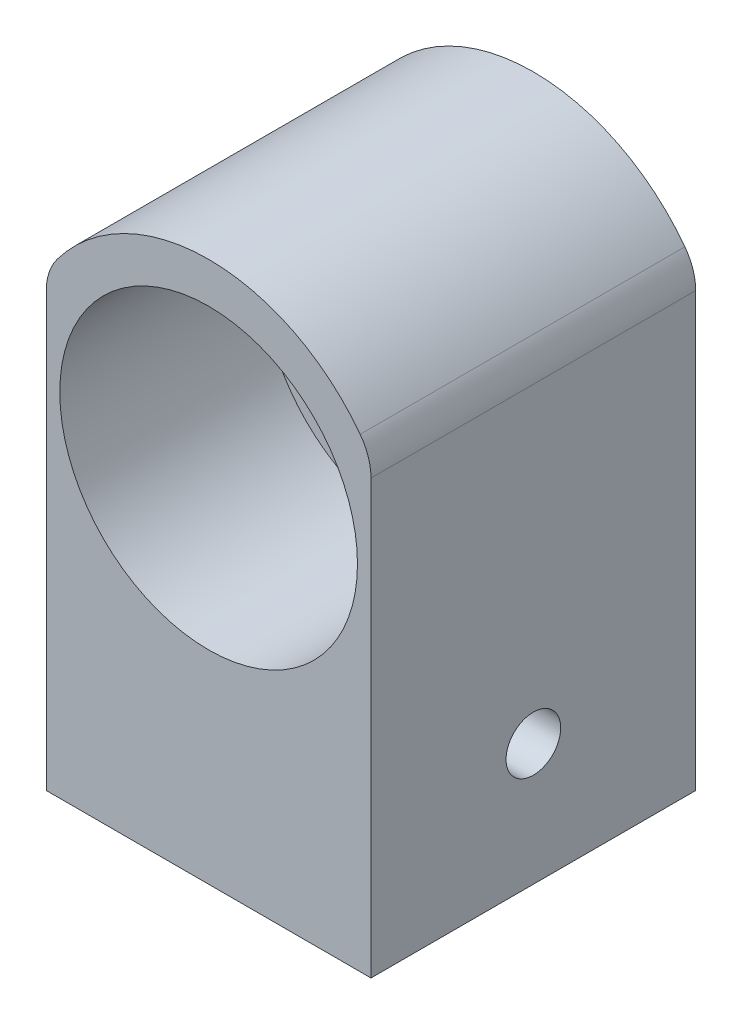
ISO-10303-21;
HEADER;
FILE_DESCRIPTION(('STEP AP214'),'2;1');
FILE_NAME('part.step','',(''),(''),'','','');
FILE_SCHEMA(('AUTOMOTIVE_DESIGN { 1 0 10303 214 1 1 1 1 }'));
ENDSEC;
DATA;
#1=APPLICATION_CONTEXT('core data for automotive mechanical design processes');
#2=APPLICATION_PROTOCOL_DEFINITION('international standard','automotive_design',2000,#1);
#3=PRODUCT_CONTEXT('',#1,'mechanical');
#4=PRODUCT('Part','Part','',(#3));
#5=PRODUCT_RELATED_PRODUCT_CATEGORY('part','',(#4));
#6=PRODUCT_DEFINITION_FORMATION('','',#4);
#7=PRODUCT_DEFINITION_CONTEXT('part definition',#1,'design');
#8=PRODUCT_DEFINITION('design','',#6,#7);
#9=PRODUCT_DEFINITION_SHAPE('','',#8);
#10=(LENGTH_UNIT() NAMED_UNIT(*) SI_UNIT(.MILLI.,.METRE.));
#11=(NAMED_UNIT(*) PLANE_ANGLE_UNIT() SI_UNIT($,.RADIAN.));
#12=(NAMED_UNIT(*) SI_UNIT($,.STERADIAN.) SOLID_ANGLE_UNIT());
#13=UNCERTAINTY_MEASURE_WITH_UNIT(LENGTH_MEASURE(1.E-05),#10,'distance_accuracy_value','');
#14=(GEOMETRIC_REPRESENTATION_CONTEXT(3) GLOBAL_UNCERTAINTY_ASSIGNED_CONTEXT((#13)) GLOBAL_UNIT_ASSIGNED_CONTEXT((#10,
#11,#12)) REPRESENTATION_CONTEXT('',''));
#15=CARTESIAN_POINT('',(0.,0.,0.));
#16=DIRECTION('',(0.,0.,1.));
#17=DIRECTION('',(1.,0.,0.));
#18=AXIS2_PLACEMENT_3D('',#15,#16,#17);
#19=CARTESIAN_POINT('',(38.1,127.,38.1));
#20=DIRECTION('',(-1.,0.,0.));
#21=DIRECTION('',(0.,0.,1.));
#22=AXIS2_PLACEMENT_3D('',#19,#20,#21);
#23=PLANE('',#22);
#24=CARTESIAN_POINT('',(38.1,28.575,0.));
#25=DIRECTION('',(1.,0.,0.));
#26=DIRECTION('',(0.,0.,-1.));
#27=AXIS2_PLACEMENT_3D('',#24,#25,#26);
#28=CIRCLE('',#27,6.4135);
#29=CARTESIAN_POINT('',(38.1,28.575,-6.4135));
#30=VERTEX_POINT('',#29);
#31=EDGE_CURVE('E197',#30,#30,#28,.T.);
#32=ORIENTED_EDGE('',*,*,#31,.F.);
#33=EDGE_LOOP('',(#32));
#34=FACE_BOUND('',#33,.T.);
#35=DIRECTION('',(0.,-1.,0.));
#36=VECTOR('',#35,1.);
#37=CARTESIAN_POINT('',(38.1,127.,-38.1));
#38=LINE('',#37,#36);
#39=CARTESIAN_POINT('',(38.1,101.6,-38.1));
#40=VERTEX_POINT('',#39);
#41=CARTESIAN_POINT('',(38.1,0.,-38.1));
#42=VERTEX_POINT('',#41);
#43=EDGE_CURVE('E302',#40,#42,#38,.T.);
#44=ORIENTED_EDGE('',*,*,#43,.F.);
#45=DIRECTION('',(0.,0.,1.));
#46=VECTOR('',#45,1.);
#47=CARTESIAN_POINT('',(38.1,101.6,38.1));
#48=LINE('',#47,#46);
#49=CARTESIAN_POINT('',(38.1,101.6,38.1));
#50=VERTEX_POINT('',#49);
#51=EDGE_CURVE('E304',#40,#50,#48,.T.);
#52=ORIENTED_EDGE('',*,*,#51,.T.);
#53=DIRECTION('',(0.,-1.,0.));
#54=VECTOR('',#53,1.);
#55=CARTESIAN_POINT('',(38.1,127.,38.1));
#56=LINE('',#55,#54);
#57=CARTESIAN_POINT('',(38.1,0.,38.1));
#58=VERTEX_POINT('',#57);
#59=EDGE_CURVE('E296',#50,#58,#56,.T.);
#60=ORIENTED_EDGE('',*,*,#59,.T.);
#61=DIRECTION('',(0.,0.,-1.));
#62=VECTOR('',#61,1.);
#63=CARTESIAN_POINT('',(38.1,0.,38.1));
#64=LINE('',#63,#62);
#65=EDGE_CURVE('E282',#58,#42,#64,.T.);
#66=ORIENTED_EDGE('',*,*,#65,.T.);
#67=EDGE_LOOP('',(#44,#52,#60,#66));
#68=FACE_BOUND('',#67,.T.);
#69=ADVANCED_FACE('F35',(#34,#68),#23,.F.);
#70=CARTESIAN_POINT('',(-38.1,127.,-38.1));
#71=DIRECTION('',(0.,0.,1.));
#72=DIRECTION('',(1.,0.,0.));
#73=AXIS2_PLACEMENT_3D('',#70,#71,#72);
#74=PLANE('',#73);
#75=DIRECTION('',(0.707106781186547,0.707106781186548,0.));
#76=VECTOR('',#75,1.);
#77=CARTESIAN_POINT('',(-22.225,91.7558964237421,-38.1));
#78=LINE('',#77,#76);
#79=CARTESIAN_POINT('',(-22.225,91.7558964237421,-38.1));
#80=VERTEX_POINT('',#79);
#81=CARTESIAN_POINT('',(-9.20589642374206,104.775,-38.1));
#82=VERTEX_POINT('',#81);
#83=EDGE_CURVE('E230',#80,#82,#78,.T.);
#84=ORIENTED_EDGE('',*,*,#83,.F.);
#85=DIRECTION('',(0.,1.,0.));
#86=VECTOR('',#85,1.);
#87=CARTESIAN_POINT('',(-22.225,73.344103576258,-38.1));
#88=LINE('',#87,#86);
#89=CARTESIAN_POINT('',(-22.225,73.344103576258,-38.1));
#90=VERTEX_POINT('',#89);
#91=EDGE_CURVE('E233',#90,#80,#88,.T.);
#92=ORIENTED_EDGE('',*,*,#91,.F.);
#93=DIRECTION('',(-0.707106781186547,0.707106781186548,0.));
#94=VECTOR('',#93,1.);
#95=CARTESIAN_POINT('',(-9.20589642374206,60.325,-38.1));
#96=LINE('',#95,#94);
#97=CARTESIAN_POINT('',(-9.20589642374205,60.325,-38.1));
#98=VERTEX_POINT('',#97);
#99=EDGE_CURVE('E212',#98,#90,#96,.T.);
#100=ORIENTED_EDGE('',*,*,#99,.F.);
#101=DIRECTION('',(-1.,0.,0.));
#102=VECTOR('',#101,1.);
#103=CARTESIAN_POINT('',(9.20589642374203,60.325,-38.1));
#104=LINE('',#103,#102);
#105=CARTESIAN_POINT('',(9.20589642374203,60.325,-38.1));
#106=VERTEX_POINT('',#105);
#107=EDGE_CURVE('E215',#106,#98,#104,.T.);
#108=ORIENTED_EDGE('',*,*,#107,.F.);
#109=DIRECTION('',(-0.707106781186548,-0.707106781186547,0.));
#110=VECTOR('',#109,1.);
#111=CARTESIAN_POINT('',(22.225,73.3441035762579,-38.1));
#112=LINE('',#111,#110);
#113=CARTESIAN_POINT('',(22.225,73.3441035762579,-38.1));
#114=VERTEX_POINT('',#113);
#115=EDGE_CURVE('E218',#114,#106,#112,.T.);
#116=ORIENTED_EDGE('',*,*,#115,.F.);
#117=DIRECTION('',(0.,-1.,0.));
#118=VECTOR('',#117,1.);
#119=CARTESIAN_POINT('',(22.225,91.7558964237421,-38.1));
#120=LINE('',#119,#118);
#121=CARTESIAN_POINT('',(22.225,91.7558964237421,-38.1));
#122=VERTEX_POINT('',#121);
#123=EDGE_CURVE('E221',#122,#114,#120,.T.);
#124=ORIENTED_EDGE('',*,*,#123,.F.);
#125=DIRECTION('',(0.707106781186548,-0.707106781186547,0.));
#126=VECTOR('',#125,1.);
#127=CARTESIAN_POINT('',(9.20589642374206,104.775,-38.1));
#128=LINE('',#127,#126);
#129=CARTESIAN_POINT('',(9.20589642374206,104.775,-38.1));
#130=VERTEX_POINT('',#129);
#131=EDGE_CURVE('E224',#130,#122,#128,.T.);
#132=ORIENTED_EDGE('',*,*,#131,.F.);
#133=DIRECTION('',(1.,0.,0.));
#134=VECTOR('',#133,1.);
#135=CARTESIAN_POINT('',(-9.20589642374206,104.775,-38.1));
#136=LINE('',#135,#134);
#137=EDGE_CURVE('E227',#82,#130,#136,.T.);
#138=ORIENTED_EDGE('',*,*,#137,.F.);
#139=EDGE_LOOP('',(#84,#92,#100,#108,#116,#124,#132,#138));
#140=FACE_BOUND('',#139,.T.);
#141=CARTESIAN_POINT('',(0.,82.55,-38.1));
#142=DIRECTION('',(0.,0.,1.));
#143=DIRECTION('',(1.,0.,0.));
#144=AXIS2_PLACEMENT_3D('',#141,#142,#143);
#145=CIRCLE('',#144,44.45);
#146=CARTESIAN_POINT('',(35.56,109.22,-38.1));
#147=VERTEX_POINT('',#146);
#148=CARTESIAN_POINT('',(-35.56,109.22,-38.1));
#149=VERTEX_POINT('',#148);
#150=EDGE_CURVE('E201',#147,#149,#145,.T.);
#151=ORIENTED_EDGE('',*,*,#150,.F.);
#152=CARTESIAN_POINT('',(25.4,101.6,-38.1));
#153=DIRECTION('',(0.,0.,1.));
#154=DIRECTION('',(1.,0.,0.));
#155=AXIS2_PLACEMENT_3D('',#152,#153,#154);
#156=CIRCLE('',#155,12.7);
#157=EDGE_CURVE('E43',#147,#40,#156,.F.);
#158=ORIENTED_EDGE('',*,*,#157,.T.);
#159=ORIENTED_EDGE('',*,*,#43,.T.);
#160=DIRECTION('',(-1.,0.,0.));
#161=VECTOR('',#160,1.);
#162=CARTESIAN_POINT('',(-38.1,0.,-38.1));
#163=LINE('',#162,#161);
#164=CARTESIAN_POINT('',(-38.1,0.,-38.1));
#165=VERTEX_POINT('',#164);
#166=EDGE_CURVE('E287',#42,#165,#163,.T.);
#167=ORIENTED_EDGE('',*,*,#166,.T.);
#168=DIRECTION('',(0.,-1.,0.));
#169=VECTOR('',#168,1.);
#170=CARTESIAN_POINT('',(-38.1,127.,-38.1));
#171=LINE('',#170,#169);
#172=CARTESIAN_POINT('',(-38.1,101.6,-38.1));
#173=VERTEX_POINT('',#172);
#174=EDGE_CURVE('E300',#173,#165,#171,.T.);
#175=ORIENTED_EDGE('',*,*,#174,.F.);
#176=CARTESIAN_POINT('',(-25.4,101.6,-38.1));
#177=DIRECTION('',(0.,0.,1.));
#178=DIRECTION('',(1.,0.,0.));
#179=AXIS2_PLACEMENT_3D('',#176,#177,#178);
#180=CIRCLE('',#179,12.7);
#181=EDGE_CURVE('E55',#173,#149,#180,.F.);
#182=ORIENTED_EDGE('',*,*,#181,.T.);
#183=EDGE_LOOP('',(#151,#158,#159,#167,#175,#182));
#184=FACE_BOUND('',#183,.T.);
#185=ADVANCED_FACE('F318',(#140,#184),#74,.F.);
#186=CARTESIAN_POINT('',(-38.1,127.,38.1));
#187=DIRECTION('',(1.,0.,0.));
#188=DIRECTION('',(0.,0.,-1.));
#189=AXIS2_PLACEMENT_3D('',#186,#187,#188);
#190=PLANE('',#189);
#191=CARTESIAN_POINT('',(-38.1,49.1972299276168,11.9062500000002));
#192=DIRECTION('',(-1.,0.,0.));
#193=DIRECTION('',(0.,0.,1.));
#194=AXIS2_PLACEMENT_3D('',#191,#192,#193);
#195=CIRCLE('',#194,1.984375);
#196=CARTESIAN_POINT('',(-38.1,49.1972299276168,13.8906250000002));
#197=VERTEX_POINT('',#196);
#198=EDGE_CURVE('E163',#197,#197,#195,.T.);
#199=ORIENTED_EDGE('',*,*,#198,.F.);
#200=EDGE_LOOP('',(#199));
#201=FACE_BOUND('',#200,.T.);
#202=CARTESIAN_POINT('',(-38.1,49.1972299276171,-11.9062499999998));
#203=DIRECTION('',(-1.,0.,0.));
#204=DIRECTION('',(0.,0.,1.));
#205=AXIS2_PLACEMENT_3D('',#202,#203,#204);
#206=CIRCLE('',#205,1.984375);
#207=CARTESIAN_POINT('',(-38.1,49.1972299276171,-9.92187499999982));
#208=VERTEX_POINT('',#207);
#209=EDGE_CURVE('E162',#208,#208,#206,.T.);
#210=ORIENTED_EDGE('',*,*,#209,.F.);
#211=EDGE_LOOP('',(#210));
#212=FACE_BOUND('',#211,.T.);
#213=CARTESIAN_POINT('',(-38.1,28.575,-23.8125));
#214=DIRECTION('',(-1.,0.,0.));
#215=DIRECTION('',(0.,0.,1.));
#216=AXIS2_PLACEMENT_3D('',#213,#214,#215);
#217=CIRCLE('',#216,1.984375);
#218=CARTESIAN_POINT('',(-38.1,28.575,-21.828125));
#219=VERTEX_POINT('',#218);
#220=EDGE_CURVE('E173',#219,#219,#217,.T.);
#221=ORIENTED_EDGE('',*,*,#220,.F.);
#222=EDGE_LOOP('',(#221));
#223=FACE_BOUND('',#222,.T.);
#224=CARTESIAN_POINT('',(-38.1,7.95277007238309,-11.9062500000001));
#225=DIRECTION('',(-1.,0.,0.));
#226=DIRECTION('',(0.,0.,1.));
#227=AXIS2_PLACEMENT_3D('',#224,#225,#226);
#228=CIRCLE('',#227,1.984375);
#229=CARTESIAN_POINT('',(-38.1,7.95277007238309,-9.92187500000011));
#230=VERTEX_POINT('',#229);
#231=EDGE_CURVE('E179',#230,#230,#228,.T.);
#232=ORIENTED_EDGE('',*,*,#231,.F.);
#233=EDGE_LOOP('',(#232));
#234=FACE_BOUND('',#233,.T.);
#235=CARTESIAN_POINT('',(-38.1,7.95277007238301,11.90625));
#236=DIRECTION('',(-1.,0.,0.));
#237=DIRECTION('',(0.,0.,1.));
#238=AXIS2_PLACEMENT_3D('',#235,#236,#237);
#239=CIRCLE('',#238,1.984375);
#240=CARTESIAN_POINT('',(-38.1,7.95277007238301,13.890625));
#241=VERTEX_POINT('',#240);
#242=EDGE_CURVE('E185',#241,#241,#239,.T.);
#243=ORIENTED_EDGE('',*,*,#242,.F.);
#244=EDGE_LOOP('',(#243));
#245=FACE_BOUND('',#244,.T.);
#246=CARTESIAN_POINT('',(-38.1,28.575,23.8125));
#247=DIRECTION('',(-1.,0.,0.));
#248=DIRECTION('',(0.,0.,1.));
#249=AXIS2_PLACEMENT_3D('',#246,#247,#248);
#250=CIRCLE('',#249,1.984375);
#251=CARTESIAN_POINT('',(-38.1,28.575,25.796875));
#252=VERTEX_POINT('',#251);
#253=EDGE_CURVE('E191',#252,#252,#250,.T.);
#254=ORIENTED_EDGE('',*,*,#253,.F.);
#255=EDGE_LOOP('',(#254));
#256=FACE_BOUND('',#255,.T.);
#257=CARTESIAN_POINT('',(-38.1,28.575,0.));
#258=DIRECTION('',(1.,0.,0.));
#259=DIRECTION('',(0.,0.,-1.));
#260=AXIS2_PLACEMENT_3D('',#257,#258,#259);
#261=CIRCLE('',#260,6.4135);
#262=CARTESIAN_POINT('',(-38.1,28.575,-6.4135));
#263=VERTEX_POINT('',#262);
#264=EDGE_CURVE('E198',#263,#263,#261,.T.);
#265=ORIENTED_EDGE('',*,*,#264,.T.);
#266=EDGE_LOOP('',(#265));
#267=FACE_BOUND('',#266,.T.);
#268=DIRECTION('',(0.,-1.,0.));
#269=VECTOR('',#268,1.);
#270=CARTESIAN_POINT('',(-38.1,127.,38.1));
#271=LINE('',#270,#269);
#272=CARTESIAN_POINT('',(-38.1,101.6,38.1));
#273=VERTEX_POINT('',#272);
#274=CARTESIAN_POINT('',(-38.1,0.,38.1));
#275=VERTEX_POINT('',#274);
#276=EDGE_CURVE('E298',#273,#275,#271,.T.);
#277=ORIENTED_EDGE('',*,*,#276,.F.);
#278=DIRECTION('',(0.,0.,1.));
#279=VECTOR('',#278,1.);
#280=CARTESIAN_POINT('',(-38.1,101.6,38.1));
#281=LINE('',#280,#279);
#282=EDGE_CURVE('E12',#273,#173,#281,.F.);
#283=ORIENTED_EDGE('',*,*,#282,.T.);
#284=ORIENTED_EDGE('',*,*,#174,.T.);
#285=DIRECTION('',(0.,0.,1.));
#286=VECTOR('',#285,1.);
#287=CARTESIAN_POINT('',(-38.1,0.,38.1));
#288=LINE('',#287,#286);
#289=EDGE_CURVE('E290',#165,#275,#288,.T.);
#290=ORIENTED_EDGE('',*,*,#289,.T.);
#291=EDGE_LOOP('',(#277,#283,#284,#290));
#292=FACE_BOUND('',#291,.T.);
#293=ADVANCED_FACE('F334',(#201,#212,#223,#234,#245,#256,#267,#292),#190,.F.);
#294=CARTESIAN_POINT('',(-38.1,127.,38.1));
#295=DIRECTION('',(0.,0.,-1.));
#296=DIRECTION('',(-1.,0.,0.));
#297=AXIS2_PLACEMENT_3D('',#294,#295,#296);
#298=PLANE('',#297);
#299=CARTESIAN_POINT('',(0.,82.55,38.1));
#300=DIRECTION('',(0.,0.,1.));
#301=DIRECTION('',(1.,0.,0.));
#302=AXIS2_PLACEMENT_3D('',#299,#300,#301);
#303=CIRCLE('',#302,34.925);
#304=CARTESIAN_POINT('',(34.925,82.55,38.1));
#305=VERTEX_POINT('',#304);
#306=EDGE_CURVE('E278',#305,#305,#303,.T.);
#307=ORIENTED_EDGE('',*,*,#306,.F.);
#308=EDGE_LOOP('',(#307));
#309=FACE_BOUND('',#308,.T.);
#310=ORIENTED_EDGE('',*,*,#59,.F.);
#311=CARTESIAN_POINT('',(25.4,101.6,38.1));
#312=DIRECTION('',(0.,0.,-1.));
#313=DIRECTION('',(-1.,0.,0.));
#314=AXIS2_PLACEMENT_3D('',#311,#312,#313);
#315=CIRCLE('',#314,12.7);
#316=CARTESIAN_POINT('',(35.56,109.22,38.1));
#317=VERTEX_POINT('',#316);
#318=EDGE_CURVE('E309',#50,#317,#315,.F.);
#319=ORIENTED_EDGE('',*,*,#318,.T.);
#320=CARTESIAN_POINT('',(0.,82.55,38.1));
#321=DIRECTION('',(0.,0.,-1.));
#322=DIRECTION('',(-1.,0.,0.));
#323=AXIS2_PLACEMENT_3D('',#320,#321,#322);
#324=CIRCLE('',#323,44.45);
#325=CARTESIAN_POINT('',(-35.56,109.22,38.1));
#326=VERTEX_POINT('',#325);
#327=EDGE_CURVE('E205',#326,#317,#324,.T.);
#328=ORIENTED_EDGE('',*,*,#327,.F.);
#329=CARTESIAN_POINT('',(-25.4,101.6,38.1));
#330=DIRECTION('',(0.,0.,-1.));
#331=DIRECTION('',(-1.,0.,0.));
#332=AXIS2_PLACEMENT_3D('',#329,#330,#331);
#333=CIRCLE('',#332,12.7);
#334=EDGE_CURVE('E307',#326,#273,#333,.F.);
#335=ORIENTED_EDGE('',*,*,#334,.T.);
#336=ORIENTED_EDGE('',*,*,#276,.T.);
#337=DIRECTION('',(1.,0.,0.));
#338=VECTOR('',#337,1.);
#339=CARTESIAN_POINT('',(-38.1,0.,38.1));
#340=LINE('',#339,#338);
#341=EDGE_CURVE('E293',#275,#58,#340,.T.);
#342=ORIENTED_EDGE('',*,*,#341,.T.);
#343=EDGE_LOOP('',(#310,#319,#328,#335,#336,#342));
#344=FACE_BOUND('',#343,.T.);
#345=ADVANCED_FACE('F329',(#309,#344),#298,.F.);
#346=CARTESIAN_POINT('',(38.1,0.,-38.1));
#347=DIRECTION('',(0.,-1.,0.));
#348=DIRECTION('',(0.,0.,-1.));
#349=AXIS2_PLACEMENT_3D('',#346,#347,#348);
#350=PLANE('',#349);
#351=ORIENTED_EDGE('',*,*,#65,.F.);
#352=ORIENTED_EDGE('',*,*,#341,.F.);
#353=ORIENTED_EDGE('',*,*,#289,.F.);
#354=ORIENTED_EDGE('',*,*,#166,.F.);
#355=EDGE_LOOP('',(#351,#352,#353,#354));
#356=FACE_BOUND('',#355,.T.);
#357=ADVANCED_FACE('F338',(#356),#350,.T.);
#358=CARTESIAN_POINT('',(0.,82.55,-9.52500000000001));
#359=DIRECTION('',(0.,0.,1.));
#360=DIRECTION('',(1.,0.,0.));
#361=AXIS2_PLACEMENT_3D('',#358,#359,#360);
#362=CYLINDRICAL_SURFACE('',#361,34.925);
#363=CARTESIAN_POINT('',(0.,82.55,-9.52500000000001));
#364=DIRECTION('',(0.,0.,1.));
#365=DIRECTION('',(1.,0.,0.));
#366=AXIS2_PLACEMENT_3D('',#363,#364,#365);
#367=CIRCLE('',#366,34.925);
#368=CARTESIAN_POINT('',(34.925,82.55,-9.52500000000001));
#369=VERTEX_POINT('',#368);
#370=EDGE_CURVE('E279',#369,#369,#367,.T.);
#371=ORIENTED_EDGE('',*,*,#370,.F.);
#372=EDGE_LOOP('',(#371));
#373=FACE_BOUND('',#372,.T.);
#374=ORIENTED_EDGE('',*,*,#306,.T.);
#375=EDGE_LOOP('',(#374));
#376=FACE_BOUND('',#375,.T.);
#377=ADVANCED_FACE('F340',(#373,#376),#362,.F.);
#378=CARTESIAN_POINT('',(0.,82.55,-9.52500000000001));
#379=DIRECTION('',(0.,0.,1.));
#380=DIRECTION('',(1.,0.,0.));
#381=AXIS2_PLACEMENT_3D('',#378,#379,#380);
#382=PLANE('',#381);
#383=CARTESIAN_POINT('',(0.,82.55,-9.52500000000001));
#384=DIRECTION('',(0.,0.,1.));
#385=DIRECTION('',(1.,0.,0.));
#386=AXIS2_PLACEMENT_3D('',#383,#384,#385);
#387=CIRCLE('',#386,20.955);
#388=CARTESIAN_POINT('',(-20.955,82.55,-9.52500000000001));
#389=VERTEX_POINT('',#388);
#390=EDGE_CURVE('E208',#389,#389,#387,.F.);
#391=ORIENTED_EDGE('',*,*,#390,.T.);
#392=EDGE_LOOP('',(#391));
#393=FACE_BOUND('',#392,.T.);
#394=ORIENTED_EDGE('',*,*,#370,.T.);
#395=EDGE_LOOP('',(#394));
#396=FACE_BOUND('',#395,.T.);
#397=ADVANCED_FACE('F346',(#393,#396),#382,.T.);
#398=CARTESIAN_POINT('',(0.,82.55,-17.4625));
#399=DIRECTION('',(0.,0.,1.));
#400=DIRECTION('',(1.,0.,0.));
#401=AXIS2_PLACEMENT_3D('',#398,#399,#400);
#402=PLANE('',#401);
#403=CARTESIAN_POINT('',(0.,82.55,-17.4625));
#404=DIRECTION('',(0.,0.,-1.));
#405=DIRECTION('',(-1.,0.,0.));
#406=AXIS2_PLACEMENT_3D('',#403,#404,#405);
#407=CIRCLE('',#406,20.955);
#408=CARTESIAN_POINT('',(-20.955,82.55,-17.4625));
#409=VERTEX_POINT('',#408);
#410=EDGE_CURVE('E209',#409,#409,#407,.T.);
#411=ORIENTED_EDGE('',*,*,#410,.F.);
#412=EDGE_LOOP('',(#411));
#413=FACE_BOUND('',#412,.T.);
#414=DIRECTION('',(-0.707106781186547,0.707106781186548,0.));
#415=VECTOR('',#414,1.);
#416=CARTESIAN_POINT('',(-9.20589642374206,60.325,-17.4625));
#417=LINE('',#416,#415);
#418=CARTESIAN_POINT('',(-9.20589642374205,60.325,-17.4625));
#419=VERTEX_POINT('',#418);
#420=CARTESIAN_POINT('',(-22.225,73.344103576258,-17.4625));
#421=VERTEX_POINT('',#420);
#422=EDGE_CURVE('E241',#419,#421,#417,.T.);
#423=ORIENTED_EDGE('',*,*,#422,.T.);
#424=DIRECTION('',(0.,1.,0.));
#425=VECTOR('',#424,1.);
#426=CARTESIAN_POINT('',(-22.225,73.344103576258,-17.4625));
#427=LINE('',#426,#425);
#428=CARTESIAN_POINT('',(-22.225,91.7558964237421,-17.4625));
#429=VERTEX_POINT('',#428);
#430=EDGE_CURVE('E217',#421,#429,#427,.T.);
#431=ORIENTED_EDGE('',*,*,#430,.T.);
#432=DIRECTION('',(0.707106781186547,0.707106781186548,0.));
#433=VECTOR('',#432,1.);
#434=CARTESIAN_POINT('',(-22.225,91.7558964237421,-17.4625));
#435=LINE('',#434,#433);
#436=CARTESIAN_POINT('',(-9.20589642374206,104.775,-17.4625));
#437=VERTEX_POINT('',#436);
#438=EDGE_CURVE('E266',#429,#437,#435,.T.);
#439=ORIENTED_EDGE('',*,*,#438,.T.);
#440=DIRECTION('',(1.,0.,0.));
#441=VECTOR('',#440,1.);
#442=CARTESIAN_POINT('',(-9.20589642374206,104.775,-17.4625));
#443=LINE('',#442,#441);
#444=CARTESIAN_POINT('',(9.20589642374206,104.775,-17.4625));
#445=VERTEX_POINT('',#444);
#446=EDGE_CURVE('E262',#437,#445,#443,.T.);
#447=ORIENTED_EDGE('',*,*,#446,.T.);
#448=DIRECTION('',(0.707106781186548,-0.707106781186547,0.));
#449=VECTOR('',#448,1.);
#450=CARTESIAN_POINT('',(9.20589642374206,104.775,-17.4625));
#451=LINE('',#450,#449);
#452=CARTESIAN_POINT('',(22.225,91.7558964237421,-17.4625));
#453=VERTEX_POINT('',#452);
#454=EDGE_CURVE('E258',#445,#453,#451,.T.);
#455=ORIENTED_EDGE('',*,*,#454,.T.);
#456=DIRECTION('',(0.,-1.,0.));
#457=VECTOR('',#456,1.);
#458=CARTESIAN_POINT('',(22.225,91.7558964237421,-17.4625));
#459=LINE('',#458,#457);
#460=CARTESIAN_POINT('',(22.225,73.3441035762579,-17.4625));
#461=VERTEX_POINT('',#460);
#462=EDGE_CURVE('E254',#453,#461,#459,.T.);
#463=ORIENTED_EDGE('',*,*,#462,.T.);
#464=DIRECTION('',(-0.707106781186548,-0.707106781186547,0.));
#465=VECTOR('',#464,1.);
#466=CARTESIAN_POINT('',(22.225,73.3441035762579,-17.4625));
#467=LINE('',#466,#465);
#468=CARTESIAN_POINT('',(9.20589642374203,60.325,-17.4625));
#469=VERTEX_POINT('',#468);
#470=EDGE_CURVE('E250',#461,#469,#467,.T.);
#471=ORIENTED_EDGE('',*,*,#470,.T.);
#472=DIRECTION('',(-1.,0.,0.));
#473=VECTOR('',#472,1.);
#474=CARTESIAN_POINT('',(9.20589642374203,60.325,-17.4625));
#475=LINE('',#474,#473);
#476=EDGE_CURVE('E246',#469,#419,#475,.T.);
#477=ORIENTED_EDGE('',*,*,#476,.T.);
#478=EDGE_LOOP('',(#423,#431,#439,#447,#455,#463,#471,#477));
#479=FACE_BOUND('',#478,.T.);
#480=ADVANCED_FACE('F408',(#413,#479),#402,.F.);
#481=CARTESIAN_POINT('',(-22.225,73.344103576258,53.3367928474842));
#482=DIRECTION('',(-1.,0.,0.));
#483=DIRECTION('',(0.,-1.,0.));
#484=AXIS2_PLACEMENT_3D('',#481,#482,#483);
#485=PLANE('',#484);
#486=DIRECTION('',(0.,0.,-1.));
#487=VECTOR('',#486,1.);
#488=CARTESIAN_POINT('',(-22.225,73.344103576258,53.3367928474842));
#489=LINE('',#488,#487);
#490=EDGE_CURVE('E244',#421,#90,#489,.T.);
#491=ORIENTED_EDGE('',*,*,#490,.T.);
#492=ORIENTED_EDGE('',*,*,#91,.T.);
#493=DIRECTION('',(0.,0.,-1.));
#494=VECTOR('',#493,1.);
#495=CARTESIAN_POINT('',(-22.225,91.7558964237421,53.3367928474842));
#496=LINE('',#495,#494);
#497=EDGE_CURVE('E240',#429,#80,#496,.T.);
#498=ORIENTED_EDGE('',*,*,#497,.F.);
#499=ORIENTED_EDGE('',*,*,#430,.F.);
#500=EDGE_LOOP('',(#491,#492,#498,#499));
#501=FACE_BOUND('',#500,.T.);
#502=ADVANCED_FACE('F404',(#501),#485,.F.);
#503=CARTESIAN_POINT('',(-22.225,91.7558964237421,53.3367928474842));
#504=DIRECTION('',(-0.707106781186547,0.707106781186547,0.));
#505=DIRECTION('',(-0.707106781186547,-0.707106781186548,0.));
#506=AXIS2_PLACEMENT_3D('',#503,#504,#505);
#507=PLANE('',#506);
#508=ORIENTED_EDGE('',*,*,#497,.T.);
#509=ORIENTED_EDGE('',*,*,#83,.T.);
#510=DIRECTION('',(0.,0.,-1.));
#511=VECTOR('',#510,1.);
#512=CARTESIAN_POINT('',(-9.20589642374206,104.775,53.3367928474842));
#513=LINE('',#512,#511);
#514=EDGE_CURVE('E265',#437,#82,#513,.T.);
#515=ORIENTED_EDGE('',*,*,#514,.F.);
#516=ORIENTED_EDGE('',*,*,#438,.F.);
#517=EDGE_LOOP('',(#508,#509,#515,#516));
#518=FACE_BOUND('',#517,.T.);
#519=ADVANCED_FACE('F400',(#518),#507,.F.);
#520=CARTESIAN_POINT('',(-9.20589642374206,104.775,53.3367928474842));
#521=DIRECTION('',(0.,1.,0.));
#522=DIRECTION('',(-1.,0.,0.));
#523=AXIS2_PLACEMENT_3D('',#520,#521,#522);
#524=PLANE('',#523);
#525=ORIENTED_EDGE('',*,*,#514,.T.);
#526=ORIENTED_EDGE('',*,*,#137,.T.);
#527=DIRECTION('',(0.,0.,-1.));
#528=VECTOR('',#527,1.);
#529=CARTESIAN_POINT('',(9.20589642374206,104.775,53.3367928474842));
#530=LINE('',#529,#528);
#531=EDGE_CURVE('E261',#445,#130,#530,.T.);
#532=ORIENTED_EDGE('',*,*,#531,.F.);
#533=ORIENTED_EDGE('',*,*,#446,.F.);
#534=EDGE_LOOP('',(#525,#526,#532,#533));
#535=FACE_BOUND('',#534,.T.);
#536=ADVANCED_FACE('F396',(#535),#524,.F.);
#537=CARTESIAN_POINT('',(9.20589642374206,104.775,53.3367928474842));
#538=DIRECTION('',(0.707106781186547,0.707106781186548,0.));
#539=DIRECTION('',(-0.707106781186548,0.707106781186547,0.));
#540=AXIS2_PLACEMENT_3D('',#537,#538,#539);
#541=PLANE('',#540);
#542=ORIENTED_EDGE('',*,*,#531,.T.);
#543=ORIENTED_EDGE('',*,*,#131,.T.);
#544=DIRECTION('',(0.,0.,-1.));
#545=VECTOR('',#544,1.);
#546=CARTESIAN_POINT('',(22.225,91.7558964237421,53.3367928474842));
#547=LINE('',#546,#545);
#548=EDGE_CURVE('E257',#453,#122,#547,.T.);
#549=ORIENTED_EDGE('',*,*,#548,.F.);
#550=ORIENTED_EDGE('',*,*,#454,.F.);
#551=EDGE_LOOP('',(#542,#543,#549,#550));
#552=FACE_BOUND('',#551,.T.);
#553=ADVANCED_FACE('F392',(#552),#541,.F.);
#554=CARTESIAN_POINT('',(22.225,91.7558964237421,53.3367928474842));
#555=DIRECTION('',(1.,0.,0.));
#556=DIRECTION('',(0.,1.,0.));
#557=AXIS2_PLACEMENT_3D('',#554,#555,#556);
#558=PLANE('',#557);
#559=ORIENTED_EDGE('',*,*,#548,.T.);
#560=ORIENTED_EDGE('',*,*,#123,.T.);
#561=DIRECTION('',(0.,0.,-1.));
#562=VECTOR('',#561,1.);
#563=CARTESIAN_POINT('',(22.225,73.3441035762579,53.3367928474842));
#564=LINE('',#563,#562);
#565=EDGE_CURVE('E253',#461,#114,#564,.T.);
#566=ORIENTED_EDGE('',*,*,#565,.F.);
#567=ORIENTED_EDGE('',*,*,#462,.F.);
#568=EDGE_LOOP('',(#559,#560,#566,#567));
#569=FACE_BOUND('',#568,.T.);
#570=ADVANCED_FACE('F388',(#569),#558,.F.);
#571=CARTESIAN_POINT('',(22.225,73.3441035762579,53.3367928474842));
#572=DIRECTION('',(0.707106781186547,-0.707106781186548,0.));
#573=DIRECTION('',(0.707106781186548,0.707106781186547,0.));
#574=AXIS2_PLACEMENT_3D('',#571,#572,#573);
#575=PLANE('',#574);
#576=ORIENTED_EDGE('',*,*,#565,.T.);
#577=ORIENTED_EDGE('',*,*,#115,.T.);
#578=DIRECTION('',(0.,0.,-1.));
#579=VECTOR('',#578,1.);
#580=CARTESIAN_POINT('',(9.20589642374203,60.325,53.3367928474842));
#581=LINE('',#580,#579);
#582=EDGE_CURVE('E249',#469,#106,#581,.T.);
#583=ORIENTED_EDGE('',*,*,#582,.F.);
#584=ORIENTED_EDGE('',*,*,#470,.F.);
#585=EDGE_LOOP('',(#576,#577,#583,#584));
#586=FACE_BOUND('',#585,.T.);
#587=ADVANCED_FACE('F384',(#586),#575,.F.);
#588=CARTESIAN_POINT('',(9.20589642374203,60.325,53.3367928474842));
#589=DIRECTION('',(0.,-1.,0.));
#590=DIRECTION('',(1.,0.,0.));
#591=AXIS2_PLACEMENT_3D('',#588,#589,#590);
#592=PLANE('',#591);
#593=ORIENTED_EDGE('',*,*,#582,.T.);
#594=ORIENTED_EDGE('',*,*,#107,.T.);
#595=DIRECTION('',(0.,0.,-1.));
#596=VECTOR('',#595,1.);
#597=CARTESIAN_POINT('',(-9.20589642374206,60.325,53.3367928474842));
#598=LINE('',#597,#596);
#599=EDGE_CURVE('E245',#419,#98,#598,.T.);
#600=ORIENTED_EDGE('',*,*,#599,.F.);
#601=ORIENTED_EDGE('',*,*,#476,.F.);
#602=EDGE_LOOP('',(#593,#594,#600,#601));
#603=FACE_BOUND('',#602,.T.);
#604=ADVANCED_FACE('F380',(#603),#592,.F.);
#605=CARTESIAN_POINT('',(-9.20589642374206,60.325,53.3367928474842));
#606=DIRECTION('',(-0.707106781186548,-0.707106781186547,0.));
#607=DIRECTION('',(0.707106781186547,-0.707106781186548,0.));
#608=AXIS2_PLACEMENT_3D('',#605,#606,#607);
#609=PLANE('',#608);
#610=ORIENTED_EDGE('',*,*,#599,.T.);
#611=ORIENTED_EDGE('',*,*,#99,.T.);
#612=ORIENTED_EDGE('',*,*,#490,.F.);
#613=ORIENTED_EDGE('',*,*,#422,.F.);
#614=EDGE_LOOP('',(#610,#611,#612,#613));
#615=FACE_BOUND('',#614,.T.);
#616=ADVANCED_FACE('F372',(#615),#609,.F.);
#617=CARTESIAN_POINT('',(0.,82.55,38.101));
#618=DIRECTION('',(0.,0.,-1.));
#619=DIRECTION('',(-1.,0.,0.));
#620=AXIS2_PLACEMENT_3D('',#617,#618,#619);
#621=CYLINDRICAL_SURFACE('',#620,20.955);
#622=CARTESIAN_POINT('',(-20.955,82.55,-9.52500000000001));
#623=CARTESIAN_POINT('',(-20.955,82.55,-9.60768229166668));
#624=CARTESIAN_POINT('',(-20.955,82.55,-9.69036458333334));
#625=CARTESIAN_POINT('',(-20.955,82.55,-9.85572916666668));
#626=CARTESIAN_POINT('',(-20.955,82.55,-9.93841145833334));
#627=CARTESIAN_POINT('',(-20.955,82.55,-10.1037760416667));
#628=CARTESIAN_POINT('',(-20.955,82.55,-10.1864583333333));
#629=CARTESIAN_POINT('',(-20.955,82.55,-10.3518229166667));
#630=CARTESIAN_POINT('',(-20.955,82.55,-10.4345052083333));
#631=CARTESIAN_POINT('',(-20.955,82.55,-10.5998697916667));
#632=CARTESIAN_POINT('',(-20.955,82.55,-10.6825520833333));
#633=CARTESIAN_POINT('',(-20.955,82.55,-10.8479166666667));
#634=CARTESIAN_POINT('',(-20.955,82.55,-10.9305989583333));
#635=CARTESIAN_POINT('',(-20.955,82.55,-11.0959635416667));
#636=CARTESIAN_POINT('',(-20.955,82.55,-11.1786458333333));
#637=CARTESIAN_POINT('',(-20.955,82.55,-11.3440104166667));
#638=CARTESIAN_POINT('',(-20.955,82.55,-11.4266927083333));
#639=CARTESIAN_POINT('',(-20.955,82.55,-11.5920572916667));
#640=CARTESIAN_POINT('',(-20.955,82.55,-11.6747395833333));
#641=CARTESIAN_POINT('',(-20.955,82.55,-11.8401041666667));
#642=CARTESIAN_POINT('',(-20.955,82.55,-11.9227864583333));
#643=CARTESIAN_POINT('',(-20.955,82.55,-12.0881510416667));
#644=CARTESIAN_POINT('',(-20.955,82.55,-12.1708333333333));
#645=CARTESIAN_POINT('',(-20.955,82.55,-12.3361979166667));
#646=CARTESIAN_POINT('',(-20.955,82.55,-12.4188802083333));
#647=CARTESIAN_POINT('',(-20.955,82.55,-12.5842447916667));
#648=CARTESIAN_POINT('',(-20.955,82.55,-12.6669270833333));
#649=CARTESIAN_POINT('',(-20.955,82.55,-12.8322916666667));
#650=CARTESIAN_POINT('',(-20.955,82.55,-12.9149739583333));
#651=CARTESIAN_POINT('',(-20.955,82.55,-13.0803385416667));
#652=CARTESIAN_POINT('',(-20.955,82.55,-13.1630208333333));
#653=CARTESIAN_POINT('',(-20.955,82.55,-13.3283854166667));
#654=CARTESIAN_POINT('',(-20.955,82.55,-13.4110677083333));
#655=CARTESIAN_POINT('',(-20.955,82.55,-13.5764322916667));
#656=CARTESIAN_POINT('',(-20.955,82.55,-13.6591145833333));
#657=CARTESIAN_POINT('',(-20.955,82.55,-13.8244791666667));
#658=CARTESIAN_POINT('',(-20.955,82.55,-13.9071614583333));
#659=CARTESIAN_POINT('',(-20.955,82.55,-14.0725260416667));
#660=CARTESIAN_POINT('',(-20.955,82.55,-14.1552083333333));
#661=CARTESIAN_POINT('',(-20.955,82.55,-14.3205729166667));
#662=CARTESIAN_POINT('',(-20.955,82.55,-14.4032552083333));
#663=CARTESIAN_POINT('',(-20.955,82.55,-14.5686197916667));
#664=CARTESIAN_POINT('',(-20.955,82.55,-14.6513020833333));
#665=CARTESIAN_POINT('',(-20.955,82.55,-14.8166666666667));
#666=CARTESIAN_POINT('',(-20.955,82.55,-14.8993489583333));
#667=CARTESIAN_POINT('',(-20.955,82.55,-15.0647135416667));
#668=CARTESIAN_POINT('',(-20.955,82.55,-15.1473958333333));
#669=CARTESIAN_POINT('',(-20.955,82.55,-15.3127604166667));
#670=CARTESIAN_POINT('',(-20.955,82.55,-15.3954427083333));
#671=CARTESIAN_POINT('',(-20.955,82.55,-15.5608072916667));
#672=CARTESIAN_POINT('',(-20.955,82.55,-15.6434895833333));
#673=CARTESIAN_POINT('',(-20.955,82.55,-15.8088541666667));
#674=CARTESIAN_POINT('',(-20.955,82.55,-15.8915364583333));
#675=CARTESIAN_POINT('',(-20.955,82.55,-16.0569010416667));
#676=CARTESIAN_POINT('',(-20.955,82.55,-16.1395833333333));
#677=CARTESIAN_POINT('',(-20.955,82.55,-16.3049479166667));
#678=CARTESIAN_POINT('',(-20.955,82.55,-16.3876302083333));
#679=CARTESIAN_POINT('',(-20.955,82.55,-16.5529947916667));
#680=CARTESIAN_POINT('',(-20.955,82.55,-16.6356770833333));
#681=CARTESIAN_POINT('',(-20.955,82.55,-16.8010416666667));
#682=CARTESIAN_POINT('',(-20.955,82.55,-16.8837239583333));
#683=CARTESIAN_POINT('',(-20.955,82.55,-17.0490885416667));
#684=CARTESIAN_POINT('',(-20.955,82.55,-17.1317708333333));
#685=CARTESIAN_POINT('',(-20.955,82.55,-17.2971354166667));
#686=CARTESIAN_POINT('',(-20.955,82.55,-17.3798177083333));
#687=CARTESIAN_POINT('',(-20.955,82.55,-17.4625));
#688=B_SPLINE_CURVE_WITH_KNOTS('',3,(#622,#623,#624,#625,#626,#627,#628,#629,#630,#631,#632,
#633,#634,#635,#636,#637,#638,#639,#640,#641,#642,#643,#644,#645,#646,#647,#648,#649,#650,#651,
#652,#653,#654,#655,#656,#657,#658,#659,#660,#661,#662,#663,#664,#665,#666,#667,#668,#669,#670,
#671,#672,#673,#674,#675,#676,#677,#678,#679,#680,#681,#682,#683,#684,#685,#686,#687),
.UNSPECIFIED.,.F.,.F.,(4,2,2,2,2,2,2,2,2,2,2,2,2,2,2,2,2,2,2,2,2,2,2,2,2,2,2,2,2,2,2,2,4),(0.,
0.248046874999998,0.496093749999996,0.744140625,0.992187499999998,1.240234375,1.48828125,
1.736328125,1.984375,2.23242187499999,2.48046874999999,2.728515625,2.97656249999999,
3.22460937499999,3.47265625,3.720703125,3.96874999999999,4.21679687499999,4.46484374999999,
4.71289062499999,4.96093749999999,5.20898437499999,5.45703124999999,5.70507812499999,
5.95312499999999,6.20117187499999,6.44921874999999,6.69726562499999,6.94531249999999,
7.19335937499999,7.44140624999999,7.68945312499999,7.93749999999999),.UNSPECIFIED.);
#689=EDGE_CURVE('BSEAM367',#389,#409,#688,.T.);
#690=ORIENTED_EDGE('',*,*,#390,.F.);
#691=ORIENTED_EDGE('',*,*,#410,.T.);
#692=ORIENTED_EDGE('',*,*,#689,.T.);
#693=ORIENTED_EDGE('',*,*,#689,.F.);
#694=EDGE_LOOP('',(#690,#692,#691,#693));
#695=FACE_BOUND('',#694,.T.);
#696=ADVANCED_FACE('F367',(#695),#621,.F.);
#697=CARTESIAN_POINT('',(0.,82.55,-38.101));
#698=DIRECTION('',(0.,0.,1.));
#699=DIRECTION('',(1.,0.,0.));
#700=AXIS2_PLACEMENT_3D('',#697,#698,#699);
#701=CYLINDRICAL_SURFACE('',#700,44.45);
#702=ORIENTED_EDGE('',*,*,#327,.T.);
#703=DIRECTION('',(0.,0.,1.));
#704=VECTOR('',#703,1.);
#705=CARTESIAN_POINT('',(35.56,109.22,-38.101));
#706=LINE('',#705,#704);
#707=EDGE_CURVE('E314',#317,#147,#706,.F.);
#708=ORIENTED_EDGE('',*,*,#707,.T.);
#709=ORIENTED_EDGE('',*,*,#150,.T.);
#710=DIRECTION('',(0.,0.,1.));
#711=VECTOR('',#710,1.);
#712=CARTESIAN_POINT('',(-35.56,109.22,-38.101));
#713=LINE('',#712,#711);
#714=EDGE_CURVE('E311',#149,#326,#713,.T.);
#715=ORIENTED_EDGE('',*,*,#714,.T.);
#716=EDGE_LOOP('',(#702,#708,#709,#715));
#717=FACE_BOUND('',#716,.T.);
#718=ADVANCED_FACE('F331',(#717),#701,.T.);
#719=CARTESIAN_POINT('',(25.4,101.6,-38.101));
#720=DIRECTION('',(0.,0.,1.));
#721=DIRECTION('',(1.,0.,0.));
#722=AXIS2_PLACEMENT_3D('',#719,#720,#721);
#723=CYLINDRICAL_SURFACE('',#722,12.7);
#724=ORIENTED_EDGE('',*,*,#157,.F.);
#725=ORIENTED_EDGE('',*,*,#707,.F.);
#726=ORIENTED_EDGE('',*,*,#318,.F.);
#727=ORIENTED_EDGE('',*,*,#51,.F.);
#728=EDGE_LOOP('',(#724,#725,#726,#727));
#729=FACE_BOUND('',#728,.T.);
#730=ADVANCED_FACE('F326',(#729),#723,.T.);
#731=CARTESIAN_POINT('',(-25.4,101.6,-38.101));
#732=DIRECTION('',(0.,0.,1.));
#733=DIRECTION('',(1.,0.,0.));
#734=AXIS2_PLACEMENT_3D('',#731,#732,#733);
#735=CYLINDRICAL_SURFACE('',#734,12.7);
#736=ORIENTED_EDGE('',*,*,#181,.F.);
#737=ORIENTED_EDGE('',*,*,#282,.F.);
#738=ORIENTED_EDGE('',*,*,#334,.F.);
#739=ORIENTED_EDGE('',*,*,#714,.F.);
#740=EDGE_LOOP('',(#736,#737,#738,#739));
#741=FACE_BOUND('',#740,.T.);
#742=ADVANCED_FACE('F37',(#741),#735,.T.);
#743=CARTESIAN_POINT('',(-38.1,28.575,0.));
#744=DIRECTION('',(1.,0.,0.));
#745=DIRECTION('',(0.,0.,-1.));
#746=AXIS2_PLACEMENT_3D('',#743,#744,#745);
#747=CYLINDRICAL_SURFACE('',#746,6.4135);
#748=ORIENTED_EDGE('',*,*,#264,.F.);
#749=EDGE_LOOP('',(#748));
#750=FACE_BOUND('',#749,.T.);
#751=ORIENTED_EDGE('',*,*,#31,.T.);
#752=EDGE_LOOP('',(#751));
#753=FACE_BOUND('',#752,.T.);
#754=ADVANCED_FACE('F366',(#750,#753),#747,.F.);
#755=CARTESIAN_POINT('',(-28.575,28.575,23.8125));
#756=DIRECTION('',(-1.,0.,0.));
#757=DIRECTION('',(0.,0.,1.));
#758=AXIS2_PLACEMENT_3D('',#755,#756,#757);
#759=CONICAL_SURFACE('',#758,1.984375,1.02974425867665);
#760=CARTESIAN_POINT('',(-27.3826672091172,28.575,23.8125));
#761=VERTEX_POINT('',#760);
#762=VERTEX_LOOP('',#761);
#763=FACE_BOUND('',#762,.T.);
#764=CARTESIAN_POINT('',(-28.575,28.575,23.8125));
#765=DIRECTION('',(-1.,0.,0.));
#766=DIRECTION('',(0.,0.,1.));
#767=AXIS2_PLACEMENT_3D('',#764,#765,#766);
#768=CIRCLE('',#767,1.984375);
#769=CARTESIAN_POINT('',(-28.575,28.575,25.796875));
#770=VERTEX_POINT('',#769);
#771=EDGE_CURVE('E194',#770,#770,#768,.T.);
#772=ORIENTED_EDGE('',*,*,#771,.T.);
#773=EDGE_LOOP('',(#772));
#774=FACE_BOUND('',#773,.T.);
#775=ADVANCED_FACE('F526',(#763,#774),#759,.F.);
#776=CARTESIAN_POINT('',(-38.1,28.575,23.8125));
#777=DIRECTION('',(-1.,0.,0.));
#778=DIRECTION('',(0.,0.,1.));
#779=AXIS2_PLACEMENT_3D('',#776,#777,#778);
#780=CYLINDRICAL_SURFACE('',#779,1.984375);
#781=ORIENTED_EDGE('',*,*,#771,.F.);
#782=EDGE_LOOP('',(#781));
#783=FACE_BOUND('',#782,.T.);
#784=ORIENTED_EDGE('',*,*,#253,.T.);
#785=EDGE_LOOP('',(#784));
#786=FACE_BOUND('',#785,.T.);
#787=ADVANCED_FACE('F535',(#783,#786),#780,.F.);
#788=CARTESIAN_POINT('',(-28.575,7.95277007238301,11.90625));
#789=DIRECTION('',(-1.,0.,0.));
#790=DIRECTION('',(0.,0.,1.));
#791=AXIS2_PLACEMENT_3D('',#788,#789,#790);
#792=CONICAL_SURFACE('',#791,1.984375,1.02974425867665);
#793=CARTESIAN_POINT('',(-27.3826672091172,7.95277007238301,11.90625));
#794=VERTEX_POINT('',#793);
#795=VERTEX_LOOP('',#794);
#796=FACE_BOUND('',#795,.T.);
#797=CARTESIAN_POINT('',(-28.575,7.95277007238301,11.90625));
#798=DIRECTION('',(-1.,0.,0.));
#799=DIRECTION('',(0.,0.,1.));
#800=AXIS2_PLACEMENT_3D('',#797,#798,#799);
#801=CIRCLE('',#800,1.984375);
#802=CARTESIAN_POINT('',(-28.575,7.95277007238301,13.890625));
#803=VERTEX_POINT('',#802);
#804=EDGE_CURVE('E188',#803,#803,#801,.T.);
#805=ORIENTED_EDGE('',*,*,#804,.T.);
#806=EDGE_LOOP('',(#805));
#807=FACE_BOUND('',#806,.T.);
#808=ADVANCED_FACE('F544',(#796,#807),#792,.F.);
#809=CARTESIAN_POINT('',(-38.1,7.95277007238301,11.90625));
#810=DIRECTION('',(-1.,0.,0.));
#811=DIRECTION('',(0.,0.,1.));
#812=AXIS2_PLACEMENT_3D('',#809,#810,#811);
#813=CYLINDRICAL_SURFACE('',#812,1.984375);
#814=ORIENTED_EDGE('',*,*,#804,.F.);
#815=EDGE_LOOP('',(#814));
#816=FACE_BOUND('',#815,.T.);
#817=ORIENTED_EDGE('',*,*,#242,.T.);
#818=EDGE_LOOP('',(#817));
#819=FACE_BOUND('',#818,.T.);
#820=ADVANCED_FACE('F561',(#816,#819),#813,.F.);
#821=CARTESIAN_POINT('',(-28.575,7.95277007238309,-11.9062500000001));
#822=DIRECTION('',(-1.,0.,0.));
#823=DIRECTION('',(0.,0.,1.));
#824=AXIS2_PLACEMENT_3D('',#821,#822,#823);
#825=CONICAL_SURFACE('',#824,1.984375,1.02974425867665);
#826=CARTESIAN_POINT('',(-27.3826672091172,7.95277007238309,-11.9062500000001));
#827=VERTEX_POINT('',#826);
#828=VERTEX_LOOP('',#827);
#829=FACE_BOUND('',#828,.T.);
#830=CARTESIAN_POINT('',(-28.575,7.95277007238309,-11.9062500000001));
#831=DIRECTION('',(-1.,0.,0.));
#832=DIRECTION('',(0.,0.,1.));
#833=AXIS2_PLACEMENT_3D('',#830,#831,#832);
#834=CIRCLE('',#833,1.984375);
#835=CARTESIAN_POINT('',(-28.575,7.95277007238309,-9.92187500000011));
#836=VERTEX_POINT('',#835);
#837=EDGE_CURVE('E182',#836,#836,#834,.T.);
#838=ORIENTED_EDGE('',*,*,#837,.T.);
#839=EDGE_LOOP('',(#838));
#840=FACE_BOUND('',#839,.T.);
#841=ADVANCED_FACE('F574',(#829,#840),#825,.F.);
#842=CARTESIAN_POINT('',(-38.1,7.95277007238309,-11.9062500000001));
#843=DIRECTION('',(-1.,0.,0.));
#844=DIRECTION('',(0.,0.,1.));
#845=AXIS2_PLACEMENT_3D('',#842,#843,#844);
#846=CYLINDRICAL_SURFACE('',#845,1.984375);
#847=ORIENTED_EDGE('',*,*,#837,.F.);
#848=EDGE_LOOP('',(#847));
#849=FACE_BOUND('',#848,.T.);
#850=ORIENTED_EDGE('',*,*,#231,.T.);
#851=EDGE_LOOP('',(#850));
#852=FACE_BOUND('',#851,.T.);
#853=ADVANCED_FACE('F586',(#849,#852),#846,.F.);
#854=CARTESIAN_POINT('',(-28.575,28.575,-23.8125));
#855=DIRECTION('',(-1.,0.,0.));
#856=DIRECTION('',(0.,0.,1.));
#857=AXIS2_PLACEMENT_3D('',#854,#855,#856);
#858=CONICAL_SURFACE('',#857,1.984375,1.02974425867665);
#859=CARTESIAN_POINT('',(-27.3826672091172,28.575,-23.8125));
#860=VERTEX_POINT('',#859);
#861=VERTEX_LOOP('',#860);
#862=FACE_BOUND('',#861,.T.);
#863=CARTESIAN_POINT('',(-28.575,28.575,-23.8125));
#864=DIRECTION('',(-1.,0.,0.));
#865=DIRECTION('',(0.,0.,1.));
#866=AXIS2_PLACEMENT_3D('',#863,#864,#865);
#867=CIRCLE('',#866,1.984375);
#868=CARTESIAN_POINT('',(-28.575,28.575,-21.828125));
#869=VERTEX_POINT('',#868);
#870=EDGE_CURVE('E176',#869,#869,#867,.T.);
#871=ORIENTED_EDGE('',*,*,#870,.T.);
#872=EDGE_LOOP('',(#871));
#873=FACE_BOUND('',#872,.T.);
#874=ADVANCED_FACE('F597',(#862,#873),#858,.F.);
#875=CARTESIAN_POINT('',(-38.1,28.575,-23.8125));
#876=DIRECTION('',(-1.,0.,0.));
#877=DIRECTION('',(0.,0.,1.));
#878=AXIS2_PLACEMENT_3D('',#875,#876,#877);
#879=CYLINDRICAL_SURFACE('',#878,1.984375);
#880=ORIENTED_EDGE('',*,*,#870,.F.);
#881=EDGE_LOOP('',(#880));
#882=FACE_BOUND('',#881,.T.);
#883=ORIENTED_EDGE('',*,*,#220,.T.);
#884=EDGE_LOOP('',(#883));
#885=FACE_BOUND('',#884,.T.);
#886=ADVANCED_FACE('F609',(#882,#885),#879,.F.);
#887=CARTESIAN_POINT('',(-28.575,49.1972299276171,-11.9062499999998));
#888=DIRECTION('',(-1.,0.,0.));
#889=DIRECTION('',(0.,0.,1.));
#890=AXIS2_PLACEMENT_3D('',#887,#888,#889);
#891=CONICAL_SURFACE('',#890,1.984375,1.02974425867665);
#892=CARTESIAN_POINT('',(-27.3826672091172,49.1972299276171,-11.9062499999998));
#893=VERTEX_POINT('',#892);
#894=VERTEX_LOOP('',#893);
#895=FACE_BOUND('',#894,.T.);
#896=CARTESIAN_POINT('',(-28.575,49.1972299276171,-11.9062499999998));
#897=DIRECTION('',(-1.,0.,0.));
#898=DIRECTION('',(0.,0.,1.));
#899=AXIS2_PLACEMENT_3D('',#896,#897,#898);
#900=CIRCLE('',#899,1.984375);
#901=CARTESIAN_POINT('',(-28.575,49.1972299276171,-9.92187499999982));
#902=VERTEX_POINT('',#901);
#903=EDGE_CURVE('E166',#902,#902,#900,.T.);
#904=ORIENTED_EDGE('',*,*,#903,.T.);
#905=EDGE_LOOP('',(#904));
#906=FACE_BOUND('',#905,.T.);
#907=ADVANCED_FACE('F620',(#895,#906),#891,.F.);
#908=CARTESIAN_POINT('',(-38.1,49.1972299276171,-11.9062499999998));
#909=DIRECTION('',(-1.,0.,0.));
#910=DIRECTION('',(0.,0.,1.));
#911=AXIS2_PLACEMENT_3D('',#908,#909,#910);
#912=CYLINDRICAL_SURFACE('',#911,1.984375);
#913=ORIENTED_EDGE('',*,*,#903,.F.);
#914=EDGE_LOOP('',(#913));
#915=FACE_BOUND('',#914,.T.);
#916=ORIENTED_EDGE('',*,*,#209,.T.);
#917=EDGE_LOOP('',(#916));
#918=FACE_BOUND('',#917,.T.);
#919=ADVANCED_FACE('F156',(#915,#918),#912,.F.);
#920=CARTESIAN_POINT('',(-28.575,49.1972299276168,11.9062500000002));
#921=DIRECTION('',(-1.,0.,0.));
#922=DIRECTION('',(0.,0.,1.));
#923=AXIS2_PLACEMENT_3D('',#920,#921,#922);
#924=CONICAL_SURFACE('',#923,1.984375,1.02974425867665);
#925=CARTESIAN_POINT('',(-27.3826672091172,49.1972299276168,11.9062500000002));
#926=VERTEX_POINT('',#925);
#927=VERTEX_LOOP('',#926);
#928=FACE_BOUND('',#927,.T.);
#929=CARTESIAN_POINT('',(-28.575,49.1972299276168,11.9062500000002));
#930=DIRECTION('',(-1.,0.,0.));
#931=DIRECTION('',(0.,0.,1.));
#932=AXIS2_PLACEMENT_3D('',#929,#930,#931);
#933=CIRCLE('',#932,1.984375);
#934=CARTESIAN_POINT('',(-28.575,49.1972299276168,13.8906250000002));
#935=VERTEX_POINT('',#934);
#936=EDGE_CURVE('E160',#935,#935,#933,.T.);
#937=ORIENTED_EDGE('',*,*,#936,.T.);
#938=EDGE_LOOP('',(#937));
#939=FACE_BOUND('',#938,.T.);
#940=ADVANCED_FACE('F152',(#928,#939),#924,.F.);
#941=CARTESIAN_POINT('',(-38.1,49.1972299276168,11.9062500000002));
#942=DIRECTION('',(-1.,0.,0.));
#943=DIRECTION('',(0.,0.,1.));
#944=AXIS2_PLACEMENT_3D('',#941,#942,#943);
#945=CYLINDRICAL_SURFACE('',#944,1.984375);
#946=ORIENTED_EDGE('',*,*,#936,.F.);
#947=EDGE_LOOP('',(#946));
#948=FACE_BOUND('',#947,.T.);
#949=ORIENTED_EDGE('',*,*,#198,.T.);
#950=EDGE_LOOP('',(#949));
#951=FACE_BOUND('',#950,.T.);
#952=ADVANCED_FACE('F155',(#948,#951),#945,.F.);
#953=CLOSED_SHELL('',(#69,#185,#293,#345,#357,#377,#397,#480,#502,#519,#536,#553,#570,#587,#604,
#616,#696,#718,#730,#742,#754,#775,#787,#808,#820,#841,#853,#874,#886,#907,#919,#940,#952));
#954=MANIFOLD_SOLID_BREP('B2',#953);
#955=ADVANCED_BREP_SHAPE_REPRESENTATION('',(#18,#954),#14);
#956=SHAPE_DEFINITION_REPRESENTATION(#9,#955);
ENDSEC;
END-ISO-10303-21;
